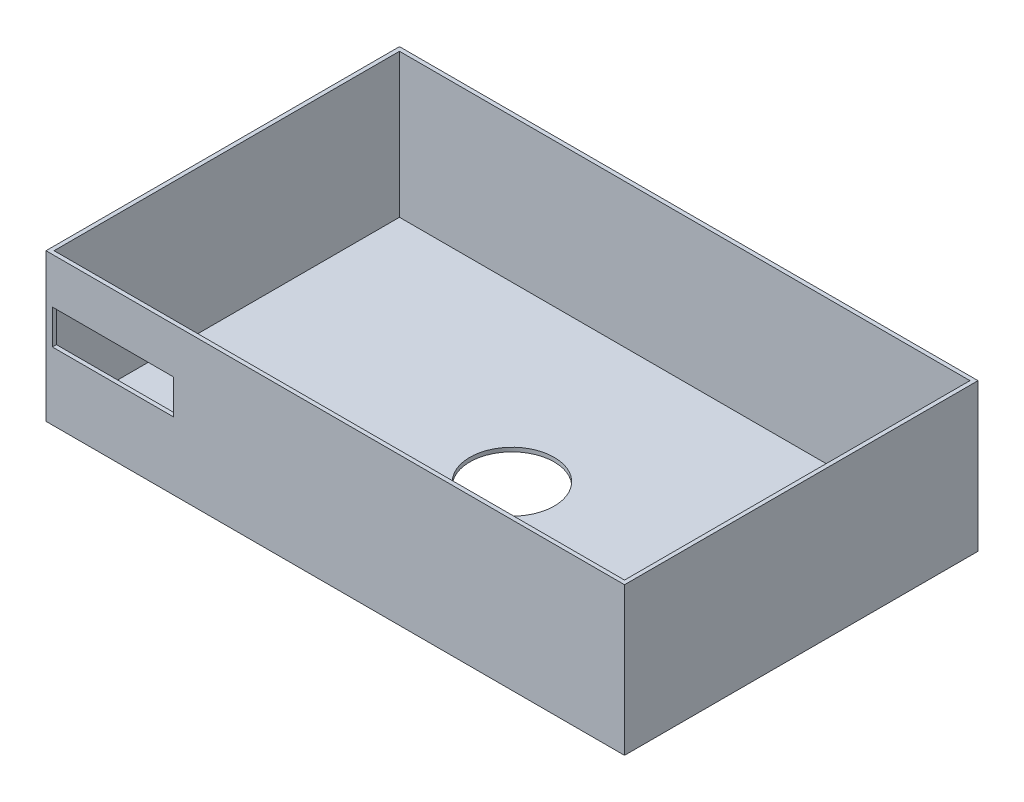
ISO-10303-21;
HEADER;
FILE_DESCRIPTION(('STEP AP214'),'2;1');
FILE_NAME('part.step','',(''),(''),'','','');
FILE_SCHEMA(('AUTOMOTIVE_DESIGN { 1 0 10303 214 1 1 1 1 }'));
ENDSEC;
DATA;
#1=APPLICATION_CONTEXT('core data for automotive mechanical design processes');
#2=APPLICATION_PROTOCOL_DEFINITION('international standard','automotive_design',2000,#1);
#3=PRODUCT_CONTEXT('',#1,'mechanical');
#4=PRODUCT('Part','Part','',(#3));
#5=PRODUCT_RELATED_PRODUCT_CATEGORY('part','',(#4));
#6=PRODUCT_DEFINITION_FORMATION('','',#4);
#7=PRODUCT_DEFINITION_CONTEXT('part definition',#1,'design');
#8=PRODUCT_DEFINITION('design','',#6,#7);
#9=PRODUCT_DEFINITION_SHAPE('','',#8);
#10=(LENGTH_UNIT() NAMED_UNIT(*) SI_UNIT(.MILLI.,.METRE.));
#11=(NAMED_UNIT(*) PLANE_ANGLE_UNIT() SI_UNIT($,.RADIAN.));
#12=(NAMED_UNIT(*) SI_UNIT($,.STERADIAN.) SOLID_ANGLE_UNIT());
#13=UNCERTAINTY_MEASURE_WITH_UNIT(LENGTH_MEASURE(1.E-05),#10,'distance_accuracy_value','');
#14=(GEOMETRIC_REPRESENTATION_CONTEXT(3) GLOBAL_UNCERTAINTY_ASSIGNED_CONTEXT((#13)) GLOBAL_UNIT_ASSIGNED_CONTEXT((#10,
#11,#12)) REPRESENTATION_CONTEXT('',''));
#15=CARTESIAN_POINT('',(0.,0.,0.));
#16=DIRECTION('',(0.,0.,1.));
#17=DIRECTION('',(1.,0.,0.));
#18=AXIS2_PLACEMENT_3D('',#15,#16,#17);
#19=CARTESIAN_POINT('',(0.,350.,0.));
#20=DIRECTION('',(0.,-1.,0.));
#21=DIRECTION('',(0.,0.,-1.));
#22=AXIS2_PLACEMENT_3D('',#19,#20,#21);
#23=PLANE('',#22);
#24=DIRECTION('',(0.,0.,1.));
#25=VECTOR('',#24,1.);
#26=CARTESIAN_POINT('',(0.,350.,0.));
#27=LINE('',#26,#25);
#28=CARTESIAN_POINT('',(0.,350.,-837.05));
#29=VERTEX_POINT('',#28);
#30=CARTESIAN_POINT('',(0.,350.,0.));
#31=VERTEX_POINT('',#30);
#32=EDGE_CURVE('E194',#29,#31,#27,.T.);
#33=ORIENTED_EDGE('',*,*,#32,.T.);
#34=DIRECTION('',(1.,0.,0.));
#35=VECTOR('',#34,1.);
#36=CARTESIAN_POINT('',(0.,350.,0.));
#37=LINE('',#36,#35);
#38=CARTESIAN_POINT('',(1370.,350.,0.));
#39=VERTEX_POINT('',#38);
#40=EDGE_CURVE('E197',#31,#39,#37,.T.);
#41=ORIENTED_EDGE('',*,*,#40,.T.);
#42=DIRECTION('',(0.,0.,-1.));
#43=VECTOR('',#42,1.);
#44=CARTESIAN_POINT('',(1370.,350.,0.));
#45=LINE('',#44,#43);
#46=CARTESIAN_POINT('',(1370.,350.,-837.05));
#47=VERTEX_POINT('',#46);
#48=EDGE_CURVE('E200',#39,#47,#45,.T.);
#49=ORIENTED_EDGE('',*,*,#48,.T.);
#50=DIRECTION('',(-1.,0.,0.));
#51=VECTOR('',#50,1.);
#52=CARTESIAN_POINT('',(0.,350.,-837.05));
#53=LINE('',#52,#51);
#54=EDGE_CURVE('E202',#47,#29,#53,.T.);
#55=ORIENTED_EDGE('',*,*,#54,.T.);
#56=EDGE_LOOP('',(#33,#41,#49,#55));
#57=FACE_BOUND('',#56,.T.);
#58=DIRECTION('',(0.,0.,1.));
#59=VECTOR('',#58,1.);
#60=CARTESIAN_POINT('',(9.525,350.,0.));
#61=LINE('',#60,#59);
#62=CARTESIAN_POINT('',(9.525,350.,-827.525));
#63=VERTEX_POINT('',#62);
#64=CARTESIAN_POINT('',(9.525,350.,-9.525));
#65=VERTEX_POINT('',#64);
#66=EDGE_CURVE('E186',#63,#65,#61,.T.);
#67=ORIENTED_EDGE('',*,*,#66,.F.);
#68=DIRECTION('',(-1.,0.,0.));
#69=VECTOR('',#68,1.);
#70=CARTESIAN_POINT('',(0.,350.,-827.525));
#71=LINE('',#70,#69);
#72=CARTESIAN_POINT('',(1360.475,350.,-827.525));
#73=VERTEX_POINT('',#72);
#74=EDGE_CURVE('E176',#73,#63,#71,.T.);
#75=ORIENTED_EDGE('',*,*,#74,.F.);
#76=DIRECTION('',(0.,0.,-1.));
#77=VECTOR('',#76,1.);
#78=CARTESIAN_POINT('',(1360.475,350.,0.));
#79=LINE('',#78,#77);
#80=CARTESIAN_POINT('',(1360.475,350.,-9.525));
#81=VERTEX_POINT('',#80);
#82=EDGE_CURVE('E190',#81,#73,#79,.T.);
#83=ORIENTED_EDGE('',*,*,#82,.F.);
#84=DIRECTION('',(1.,0.,0.));
#85=VECTOR('',#84,1.);
#86=CARTESIAN_POINT('',(0.,350.,-9.525));
#87=LINE('',#86,#85);
#88=EDGE_CURVE('E188',#65,#81,#87,.T.);
#89=ORIENTED_EDGE('',*,*,#88,.F.);
#90=EDGE_LOOP('',(#67,#75,#83,#89));
#91=FACE_BOUND('',#90,.T.);
#92=ADVANCED_FACE('F37',(#57,#91),#23,.F.);
#93=CARTESIAN_POINT('',(0.,350.,0.));
#94=DIRECTION('',(1.,0.,0.));
#95=DIRECTION('',(0.,0.,-1.));
#96=AXIS2_PLACEMENT_3D('',#93,#94,#95);
#97=PLANE('',#96);
#98=DIRECTION('',(0.,0.,1.));
#99=VECTOR('',#98,1.);
#100=CARTESIAN_POINT('',(0.,0.,0.));
#101=LINE('',#100,#99);
#102=CARTESIAN_POINT('',(0.,0.,-837.05));
#103=VERTEX_POINT('',#102);
#104=CARTESIAN_POINT('',(0.,0.,0.));
#105=VERTEX_POINT('',#104);
#106=EDGE_CURVE('E170',#103,#105,#101,.T.);
#107=ORIENTED_EDGE('',*,*,#106,.T.);
#108=DIRECTION('',(0.,-1.,0.));
#109=VECTOR('',#108,1.);
#110=CARTESIAN_POINT('',(0.,350.,0.));
#111=LINE('',#110,#109);
#112=EDGE_CURVE('E11',#31,#105,#111,.T.);
#113=ORIENTED_EDGE('',*,*,#112,.F.);
#114=ORIENTED_EDGE('',*,*,#32,.F.);
#115=DIRECTION('',(0.,-1.,0.));
#116=VECTOR('',#115,1.);
#117=CARTESIAN_POINT('',(0.,350.,-837.05));
#118=LINE('',#117,#116);
#119=EDGE_CURVE('E204',#29,#103,#118,.T.);
#120=ORIENTED_EDGE('',*,*,#119,.T.);
#121=EDGE_LOOP('',(#107,#113,#114,#120));
#122=FACE_BOUND('',#121,.T.);
#123=ADVANCED_FACE('F39',(#122),#97,.F.);
#124=CARTESIAN_POINT('',(0.,350.,0.));
#125=DIRECTION('',(0.,0.,-1.));
#126=DIRECTION('',(-1.,0.,0.));
#127=AXIS2_PLACEMENT_3D('',#124,#125,#126);
#128=PLANE('',#127);
#129=DIRECTION('',(0.,-1.,0.));
#130=VECTOR('',#129,1.);
#131=CARTESIAN_POINT('',(15.,242.1,0.));
#132=LINE('',#131,#130);
#133=CARTESIAN_POINT('',(15.,242.1,0.));
#134=VERTEX_POINT('',#133);
#135=CARTESIAN_POINT('',(15.,160.1,0.));
#136=VERTEX_POINT('',#135);
#137=EDGE_CURVE('E150',#134,#136,#132,.T.);
#138=ORIENTED_EDGE('',*,*,#137,.F.);
#139=DIRECTION('',(-1.,0.,0.));
#140=VECTOR('',#139,1.);
#141=CARTESIAN_POINT('',(15.,242.1,0.));
#142=LINE('',#141,#140);
#143=CARTESIAN_POINT('',(302.4,242.1,0.));
#144=VERTEX_POINT('',#143);
#145=EDGE_CURVE('E143',#144,#134,#142,.T.);
#146=ORIENTED_EDGE('',*,*,#145,.F.);
#147=DIRECTION('',(0.,1.,0.));
#148=VECTOR('',#147,1.);
#149=CARTESIAN_POINT('',(302.4,242.1,0.));
#150=LINE('',#149,#148);
#151=CARTESIAN_POINT('',(302.4,160.1,0.));
#152=VERTEX_POINT('',#151);
#153=EDGE_CURVE('E154',#152,#144,#150,.T.);
#154=ORIENTED_EDGE('',*,*,#153,.F.);
#155=DIRECTION('',(1.,0.,0.));
#156=VECTOR('',#155,1.);
#157=CARTESIAN_POINT('',(15.,160.1,0.));
#158=LINE('',#157,#156);
#159=EDGE_CURVE('E52',#136,#152,#158,.T.);
#160=ORIENTED_EDGE('',*,*,#159,.F.);
#161=EDGE_LOOP('',(#138,#146,#154,#160));
#162=FACE_BOUND('',#161,.T.);
#163=DIRECTION('',(1.,0.,0.));
#164=VECTOR('',#163,1.);
#165=CARTESIAN_POINT('',(0.,0.,0.));
#166=LINE('',#165,#164);
#167=CARTESIAN_POINT('',(1370.,0.,0.));
#168=VERTEX_POINT('',#167);
#169=EDGE_CURVE('E207',#105,#168,#166,.T.);
#170=ORIENTED_EDGE('',*,*,#169,.T.);
#171=DIRECTION('',(0.,-1.,0.));
#172=VECTOR('',#171,1.);
#173=CARTESIAN_POINT('',(1370.,350.,0.));
#174=LINE('',#173,#172);
#175=EDGE_CURVE('E45',#39,#168,#174,.T.);
#176=ORIENTED_EDGE('',*,*,#175,.F.);
#177=ORIENTED_EDGE('',*,*,#40,.F.);
#178=ORIENTED_EDGE('',*,*,#112,.T.);
#179=EDGE_LOOP('',(#170,#176,#177,#178));
#180=FACE_BOUND('',#179,.T.);
#181=ADVANCED_FACE('F237',(#162,#180),#128,.F.);
#182=CARTESIAN_POINT('',(1370.,350.,0.));
#183=DIRECTION('',(-1.,0.,0.));
#184=DIRECTION('',(0.,0.,1.));
#185=AXIS2_PLACEMENT_3D('',#182,#183,#184);
#186=PLANE('',#185);
#187=DIRECTION('',(0.,0.,-1.));
#188=VECTOR('',#187,1.);
#189=CARTESIAN_POINT('',(1370.,0.,0.));
#190=LINE('',#189,#188);
#191=CARTESIAN_POINT('',(1370.,0.,-837.05));
#192=VERTEX_POINT('',#191);
#193=EDGE_CURVE('E209',#168,#192,#190,.T.);
#194=ORIENTED_EDGE('',*,*,#193,.T.);
#195=DIRECTION('',(0.,-1.,0.));
#196=VECTOR('',#195,1.);
#197=CARTESIAN_POINT('',(1370.,350.,-837.05));
#198=LINE('',#197,#196);
#199=EDGE_CURVE('E214',#47,#192,#198,.T.);
#200=ORIENTED_EDGE('',*,*,#199,.F.);
#201=ORIENTED_EDGE('',*,*,#48,.F.);
#202=ORIENTED_EDGE('',*,*,#175,.T.);
#203=EDGE_LOOP('',(#194,#200,#201,#202));
#204=FACE_BOUND('',#203,.T.);
#205=ADVANCED_FACE('F221',(#204),#186,.F.);
#206=CARTESIAN_POINT('',(0.,350.,-837.05));
#207=DIRECTION('',(0.,0.,1.));
#208=DIRECTION('',(1.,0.,0.));
#209=AXIS2_PLACEMENT_3D('',#206,#207,#208);
#210=PLANE('',#209);
#211=DIRECTION('',(-1.,0.,0.));
#212=VECTOR('',#211,1.);
#213=CARTESIAN_POINT('',(0.,0.,-837.05));
#214=LINE('',#213,#212);
#215=EDGE_CURVE('E198',#192,#103,#214,.T.);
#216=ORIENTED_EDGE('',*,*,#215,.T.);
#217=ORIENTED_EDGE('',*,*,#119,.F.);
#218=ORIENTED_EDGE('',*,*,#54,.F.);
#219=ORIENTED_EDGE('',*,*,#199,.T.);
#220=EDGE_LOOP('',(#216,#217,#218,#219));
#221=FACE_BOUND('',#220,.T.);
#222=ADVANCED_FACE('F230',(#221),#210,.F.);
#223=CARTESIAN_POINT('',(0.,0.,0.));
#224=DIRECTION('',(0.,-1.,0.));
#225=DIRECTION('',(0.,0.,-1.));
#226=AXIS2_PLACEMENT_3D('',#223,#224,#225);
#227=PLANE('',#226);
#228=CARTESIAN_POINT('',(685.,0.,-418.525));
#229=DIRECTION('',(0.,-1.,0.));
#230=DIRECTION('',(0.,0.,-1.));
#231=AXIS2_PLACEMENT_3D('',#228,#229,#230);
#232=CIRCLE('',#231,100.);
#233=CARTESIAN_POINT('',(685.,0.,-518.525));
#234=VERTEX_POINT('',#233);
#235=EDGE_CURVE('E413',#234,#234,#232,.T.);
#236=ORIENTED_EDGE('',*,*,#235,.F.);
#237=EDGE_LOOP('',(#236));
#238=FACE_BOUND('',#237,.T.);
#239=ORIENTED_EDGE('',*,*,#106,.F.);
#240=ORIENTED_EDGE('',*,*,#215,.F.);
#241=ORIENTED_EDGE('',*,*,#193,.F.);
#242=ORIENTED_EDGE('',*,*,#169,.F.);
#243=EDGE_LOOP('',(#239,#240,#241,#242));
#244=FACE_BOUND('',#243,.T.);
#245=ADVANCED_FACE('F227',(#238,#244),#227,.T.);
#246=CARTESIAN_POINT('',(9.525,350.,0.));
#247=DIRECTION('',(1.,0.,0.));
#248=DIRECTION('',(0.,0.,-1.));
#249=AXIS2_PLACEMENT_3D('',#246,#247,#248);
#250=PLANE('',#249);
#251=DIRECTION('',(0.,0.,1.));
#252=VECTOR('',#251,1.);
#253=CARTESIAN_POINT('',(9.525,9.525,0.));
#254=LINE('',#253,#252);
#255=CARTESIAN_POINT('',(9.525,9.525,-827.525));
#256=VERTEX_POINT('',#255);
#257=CARTESIAN_POINT('',(9.525,9.525,-9.525));
#258=VERTEX_POINT('',#257);
#259=EDGE_CURVE('E163',#256,#258,#254,.T.);
#260=ORIENTED_EDGE('',*,*,#259,.F.);
#261=DIRECTION('',(0.,-1.,0.));
#262=VECTOR('',#261,1.);
#263=CARTESIAN_POINT('',(9.525,350.,-827.525));
#264=LINE('',#263,#262);
#265=EDGE_CURVE('E172',#63,#256,#264,.T.);
#266=ORIENTED_EDGE('',*,*,#265,.F.);
#267=ORIENTED_EDGE('',*,*,#66,.T.);
#268=DIRECTION('',(0.,-1.,0.));
#269=VECTOR('',#268,1.);
#270=CARTESIAN_POINT('',(9.525,350.,-9.525));
#271=LINE('',#270,#269);
#272=EDGE_CURVE('E167',#65,#258,#271,.T.);
#273=ORIENTED_EDGE('',*,*,#272,.T.);
#274=EDGE_LOOP('',(#260,#266,#267,#273));
#275=FACE_BOUND('',#274,.T.);
#276=ADVANCED_FACE('F255',(#275),#250,.T.);
#277=CARTESIAN_POINT('',(0.,350.,-9.525));
#278=DIRECTION('',(0.,0.,-1.));
#279=DIRECTION('',(-1.,0.,0.));
#280=AXIS2_PLACEMENT_3D('',#277,#278,#279);
#281=PLANE('',#280);
#282=DIRECTION('',(-1.,0.,0.));
#283=VECTOR('',#282,1.);
#284=CARTESIAN_POINT('',(15.,242.1,-9.52500000000001));
#285=LINE('',#284,#283);
#286=CARTESIAN_POINT('',(302.4,242.1,-9.525));
#287=VERTEX_POINT('',#286);
#288=CARTESIAN_POINT('',(15.,242.1,-9.52500000000001));
#289=VERTEX_POINT('',#288);
#290=EDGE_CURVE('E140',#287,#289,#285,.T.);
#291=ORIENTED_EDGE('',*,*,#290,.T.);
#292=DIRECTION('',(0.,-1.,0.));
#293=VECTOR('',#292,1.);
#294=CARTESIAN_POINT('',(15.,242.1,-9.52500000000001));
#295=LINE('',#294,#293);
#296=CARTESIAN_POINT('',(15.,160.1,-9.52500000000001));
#297=VERTEX_POINT('',#296);
#298=EDGE_CURVE('E127',#289,#297,#295,.T.);
#299=ORIENTED_EDGE('',*,*,#298,.T.);
#300=DIRECTION('',(1.,0.,0.));
#301=VECTOR('',#300,1.);
#302=CARTESIAN_POINT('',(15.,160.1,-9.52500000000001));
#303=LINE('',#302,#301);
#304=CARTESIAN_POINT('',(302.4,160.1,-9.52500000000001));
#305=VERTEX_POINT('',#304);
#306=EDGE_CURVE('E158',#297,#305,#303,.T.);
#307=ORIENTED_EDGE('',*,*,#306,.T.);
#308=DIRECTION('',(0.,1.,0.));
#309=VECTOR('',#308,1.);
#310=CARTESIAN_POINT('',(302.4,242.1,-9.52500000000001));
#311=LINE('',#310,#309);
#312=EDGE_CURVE('E148',#305,#287,#311,.T.);
#313=ORIENTED_EDGE('',*,*,#312,.T.);
#314=EDGE_LOOP('',(#291,#299,#307,#313));
#315=FACE_BOUND('',#314,.T.);
#316=DIRECTION('',(1.,0.,0.));
#317=VECTOR('',#316,1.);
#318=CARTESIAN_POINT('',(0.,9.525,-9.525));
#319=LINE('',#318,#317);
#320=CARTESIAN_POINT('',(1360.475,9.525,-9.525));
#321=VERTEX_POINT('',#320);
#322=EDGE_CURVE('E166',#258,#321,#319,.T.);
#323=ORIENTED_EDGE('',*,*,#322,.F.);
#324=ORIENTED_EDGE('',*,*,#272,.F.);
#325=ORIENTED_EDGE('',*,*,#88,.T.);
#326=DIRECTION('',(0.,-1.,0.));
#327=VECTOR('',#326,1.);
#328=CARTESIAN_POINT('',(1360.475,350.,-9.525));
#329=LINE('',#328,#327);
#330=EDGE_CURVE('E171',#81,#321,#329,.T.);
#331=ORIENTED_EDGE('',*,*,#330,.T.);
#332=EDGE_LOOP('',(#323,#324,#325,#331));
#333=FACE_BOUND('',#332,.T.);
#334=ADVANCED_FACE('F146',(#315,#333),#281,.T.);
#335=CARTESIAN_POINT('',(1360.475,350.,0.));
#336=DIRECTION('',(-1.,0.,0.));
#337=DIRECTION('',(0.,0.,1.));
#338=AXIS2_PLACEMENT_3D('',#335,#336,#337);
#339=PLANE('',#338);
#340=DIRECTION('',(0.,0.,-1.));
#341=VECTOR('',#340,1.);
#342=CARTESIAN_POINT('',(1360.475,9.525,0.));
#343=LINE('',#342,#341);
#344=CARTESIAN_POINT('',(1360.475,9.525,-827.525));
#345=VERTEX_POINT('',#344);
#346=EDGE_CURVE('E178',#321,#345,#343,.T.);
#347=ORIENTED_EDGE('',*,*,#346,.F.);
#348=ORIENTED_EDGE('',*,*,#330,.F.);
#349=ORIENTED_EDGE('',*,*,#82,.T.);
#350=DIRECTION('',(0.,-1.,0.));
#351=VECTOR('',#350,1.);
#352=CARTESIAN_POINT('',(1360.475,350.,-827.525));
#353=LINE('',#352,#351);
#354=EDGE_CURVE('E175',#73,#345,#353,.T.);
#355=ORIENTED_EDGE('',*,*,#354,.T.);
#356=EDGE_LOOP('',(#347,#348,#349,#355));
#357=FACE_BOUND('',#356,.T.);
#358=ADVANCED_FACE('F282',(#357),#339,.T.);
#359=CARTESIAN_POINT('',(0.,350.,-827.525));
#360=DIRECTION('',(0.,0.,1.));
#361=DIRECTION('',(1.,0.,0.));
#362=AXIS2_PLACEMENT_3D('',#359,#360,#361);
#363=PLANE('',#362);
#364=DIRECTION('',(-1.,0.,0.));
#365=VECTOR('',#364,1.);
#366=CARTESIAN_POINT('',(0.,9.525,-827.525));
#367=LINE('',#366,#365);
#368=EDGE_CURVE('E182',#345,#256,#367,.T.);
#369=ORIENTED_EDGE('',*,*,#368,.F.);
#370=ORIENTED_EDGE('',*,*,#354,.F.);
#371=ORIENTED_EDGE('',*,*,#74,.T.);
#372=ORIENTED_EDGE('',*,*,#265,.T.);
#373=EDGE_LOOP('',(#369,#370,#371,#372));
#374=FACE_BOUND('',#373,.T.);
#375=ADVANCED_FACE('F289',(#374),#363,.T.);
#376=CARTESIAN_POINT('',(0.,9.525,0.));
#377=DIRECTION('',(0.,-1.,0.));
#378=DIRECTION('',(0.,0.,-1.));
#379=AXIS2_PLACEMENT_3D('',#376,#377,#378);
#380=PLANE('',#379);
#381=CARTESIAN_POINT('',(685.,9.52500000000001,-418.525));
#382=DIRECTION('',(0.,-1.,0.));
#383=DIRECTION('',(0.,0.,-1.));
#384=AXIS2_PLACEMENT_3D('',#381,#382,#383);
#385=CIRCLE('',#384,100.);
#386=CARTESIAN_POINT('',(685.,9.52500000000001,-518.525));
#387=VERTEX_POINT('',#386);
#388=EDGE_CURVE('E416',#387,#387,#385,.F.);
#389=ORIENTED_EDGE('',*,*,#388,.F.);
#390=EDGE_LOOP('',(#389));
#391=FACE_BOUND('',#390,.T.);
#392=ORIENTED_EDGE('',*,*,#259,.T.);
#393=ORIENTED_EDGE('',*,*,#322,.T.);
#394=ORIENTED_EDGE('',*,*,#346,.T.);
#395=ORIENTED_EDGE('',*,*,#368,.T.);
#396=EDGE_LOOP('',(#392,#393,#394,#395));
#397=FACE_BOUND('',#396,.T.);
#398=ADVANCED_FACE('F251',(#391,#397),#380,.F.);
#399=CARTESIAN_POINT('',(15.,242.1,-308.394135241497));
#400=DIRECTION('',(0.,1.,0.));
#401=DIRECTION('',(0.,0.,1.));
#402=AXIS2_PLACEMENT_3D('',#399,#400,#401);
#403=PLANE('',#402);
#404=DIRECTION('',(0.,0.,1.));
#405=VECTOR('',#404,1.);
#406=CARTESIAN_POINT('',(302.4,242.1,-308.394135241497));
#407=LINE('',#406,#405);
#408=EDGE_CURVE('E60',#287,#144,#407,.T.);
#409=ORIENTED_EDGE('',*,*,#408,.T.);
#410=ORIENTED_EDGE('',*,*,#145,.T.);
#411=DIRECTION('',(0.,0.,1.));
#412=VECTOR('',#411,1.);
#413=CARTESIAN_POINT('',(15.,242.1,-308.394135241497));
#414=LINE('',#413,#412);
#415=EDGE_CURVE('E131',#289,#134,#414,.T.);
#416=ORIENTED_EDGE('',*,*,#415,.F.);
#417=ORIENTED_EDGE('',*,*,#290,.F.);
#418=EDGE_LOOP('',(#409,#410,#416,#417));
#419=FACE_BOUND('',#418,.T.);
#420=ADVANCED_FACE('F139',(#419),#403,.F.);
#421=CARTESIAN_POINT('',(15.,242.1,-308.394135241497));
#422=DIRECTION('',(-1.,0.,0.));
#423=DIRECTION('',(0.,0.,1.));
#424=AXIS2_PLACEMENT_3D('',#421,#422,#423);
#425=PLANE('',#424);
#426=ORIENTED_EDGE('',*,*,#415,.T.);
#427=ORIENTED_EDGE('',*,*,#137,.T.);
#428=DIRECTION('',(0.,0.,1.));
#429=VECTOR('',#428,1.);
#430=CARTESIAN_POINT('',(15.,160.1,-308.394135241497));
#431=LINE('',#430,#429);
#432=EDGE_CURVE('E133',#297,#136,#431,.T.);
#433=ORIENTED_EDGE('',*,*,#432,.F.);
#434=ORIENTED_EDGE('',*,*,#298,.F.);
#435=EDGE_LOOP('',(#426,#427,#433,#434));
#436=FACE_BOUND('',#435,.T.);
#437=ADVANCED_FACE('F129',(#436),#425,.F.);
#438=CARTESIAN_POINT('',(15.,160.1,-308.394135241497));
#439=DIRECTION('',(0.,-1.,0.));
#440=DIRECTION('',(0.,0.,-1.));
#441=AXIS2_PLACEMENT_3D('',#438,#439,#440);
#442=PLANE('',#441);
#443=ORIENTED_EDGE('',*,*,#432,.T.);
#444=ORIENTED_EDGE('',*,*,#159,.T.);
#445=DIRECTION('',(0.,0.,1.));
#446=VECTOR('',#445,1.);
#447=CARTESIAN_POINT('',(302.4,160.1,-308.394135241497));
#448=LINE('',#447,#446);
#449=EDGE_CURVE('E157',#305,#152,#448,.T.);
#450=ORIENTED_EDGE('',*,*,#449,.F.);
#451=ORIENTED_EDGE('',*,*,#306,.F.);
#452=EDGE_LOOP('',(#443,#444,#450,#451));
#453=FACE_BOUND('',#452,.T.);
#454=ADVANCED_FACE('F314',(#453),#442,.F.);
#455=CARTESIAN_POINT('',(302.4,242.1,-308.394135241497));
#456=DIRECTION('',(1.,0.,0.));
#457=DIRECTION('',(0.,1.,0.));
#458=AXIS2_PLACEMENT_3D('',#455,#456,#457);
#459=PLANE('',#458);
#460=ORIENTED_EDGE('',*,*,#449,.T.);
#461=ORIENTED_EDGE('',*,*,#153,.T.);
#462=ORIENTED_EDGE('',*,*,#408,.F.);
#463=ORIENTED_EDGE('',*,*,#312,.F.);
#464=EDGE_LOOP('',(#460,#461,#462,#463));
#465=FACE_BOUND('',#464,.T.);
#466=ADVANCED_FACE('F321',(#465),#459,.F.);
#467=CARTESIAN_POINT('',(685.,350.001,-418.525));
#468=DIRECTION('',(0.,-1.,0.));
#469=DIRECTION('',(0.,0.,-1.));
#470=AXIS2_PLACEMENT_3D('',#467,#468,#469);
#471=CYLINDRICAL_SURFACE('',#470,100.);
#472=ORIENTED_EDGE('',*,*,#235,.T.);
#473=EDGE_LOOP('',(#472));
#474=FACE_BOUND('',#473,.T.);
#475=ORIENTED_EDGE('',*,*,#388,.T.);
#476=EDGE_LOOP('',(#475));
#477=FACE_BOUND('',#476,.T.);
#478=ADVANCED_FACE('F327',(#474,#477),#471,.F.);
#479=CLOSED_SHELL('',(#92,#123,#181,#205,#222,#245,#276,#334,#358,#375,#398,#420,#437,#454,#466,#478));
#480=MANIFOLD_SOLID_BREP('B2',#479);
#481=ADVANCED_BREP_SHAPE_REPRESENTATION('',(#18,#480),#14);
#482=SHAPE_DEFINITION_REPRESENTATION(#9,#481);
ENDSEC;
END-ISO-10303-21;
